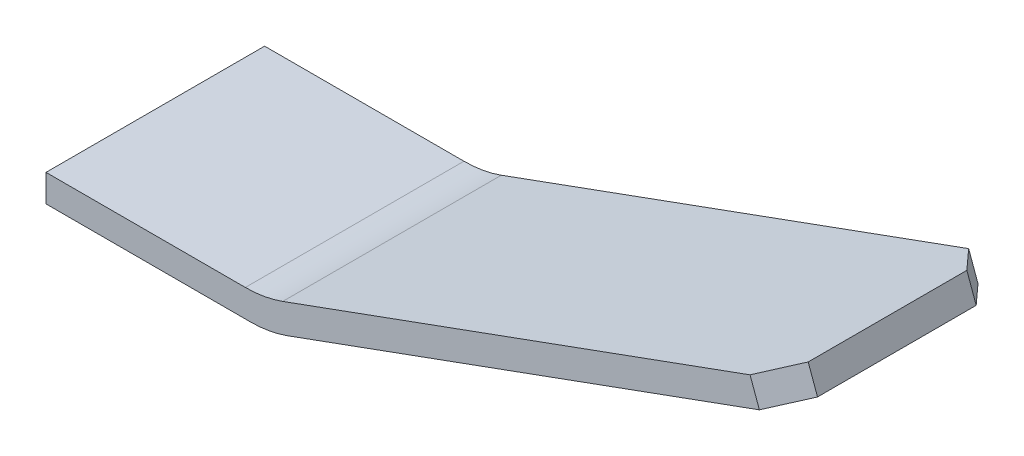
ISO-10303-21;
HEADER;
FILE_DESCRIPTION(('STEP AP214'),'2;1');
FILE_NAME('part.step','',(''),(''),'','','');
FILE_SCHEMA(('AUTOMOTIVE_DESIGN { 1 0 10303 214 1 1 1 1 }'));
ENDSEC;
DATA;
#1=APPLICATION_CONTEXT('core data for automotive mechanical design processes');
#2=APPLICATION_PROTOCOL_DEFINITION('international standard','automotive_design',2000,#1);
#3=PRODUCT_CONTEXT('',#1,'mechanical');
#4=PRODUCT('Part','Part','',(#3));
#5=PRODUCT_RELATED_PRODUCT_CATEGORY('part','',(#4));
#6=PRODUCT_DEFINITION_FORMATION('','',#4);
#7=PRODUCT_DEFINITION_CONTEXT('part definition',#1,'design');
#8=PRODUCT_DEFINITION('design','',#6,#7);
#9=PRODUCT_DEFINITION_SHAPE('','',#8);
#10=(LENGTH_UNIT() NAMED_UNIT(*) SI_UNIT(.MILLI.,.METRE.));
#11=(NAMED_UNIT(*) PLANE_ANGLE_UNIT() SI_UNIT($,.RADIAN.));
#12=(NAMED_UNIT(*) SI_UNIT($,.STERADIAN.) SOLID_ANGLE_UNIT());
#13=UNCERTAINTY_MEASURE_WITH_UNIT(LENGTH_MEASURE(1.E-05),#10,'distance_accuracy_value','');
#14=(GEOMETRIC_REPRESENTATION_CONTEXT(3) GLOBAL_UNCERTAINTY_ASSIGNED_CONTEXT((#13)) GLOBAL_UNIT_ASSIGNED_CONTEXT((#10,
#11,#12)) REPRESENTATION_CONTEXT('',''));
#15=CARTESIAN_POINT('',(0.,0.,0.));
#16=DIRECTION('',(0.,0.,1.));
#17=DIRECTION('',(1.,0.,0.));
#18=AXIS2_PLACEMENT_3D('',#15,#16,#17);
#19=CARTESIAN_POINT('',(25.9598381637494,0.,25.4));
#20=DIRECTION('',(0.,1.,0.));
#21=DIRECTION('',(-1.,0.,0.));
#22=AXIS2_PLACEMENT_3D('',#19,#20,#21);
#23=PLANE('',#22);
#24=DIRECTION('',(1.,0.,0.));
#25=VECTOR('',#24,1.);
#26=CARTESIAN_POINT('',(25.9598381637494,0.,0.));
#27=LINE('',#26,#25);
#28=CARTESIAN_POINT('',(0.,0.,0.));
#29=VERTEX_POINT('',#28);
#30=CARTESIAN_POINT('',(23.7204855087519,0.,0.));
#31=VERTEX_POINT('',#30);
#32=EDGE_CURVE('E171',#29,#31,#27,.T.);
#33=ORIENTED_EDGE('',*,*,#32,.T.);
#34=DIRECTION('',(0.,0.,-1.));
#35=VECTOR('',#34,1.);
#36=CARTESIAN_POINT('',(23.7204855087519,0.,25.4));
#37=LINE('',#36,#35);
#38=CARTESIAN_POINT('',(23.7204855087519,0.,25.4));
#39=VERTEX_POINT('',#38);
#40=EDGE_CURVE('E147',#31,#39,#37,.F.);
#41=ORIENTED_EDGE('',*,*,#40,.T.);
#42=DIRECTION('',(1.,0.,0.));
#43=VECTOR('',#42,1.);
#44=CARTESIAN_POINT('',(25.9598381637494,0.,25.4));
#45=LINE('',#44,#43);
#46=CARTESIAN_POINT('',(0.,0.,25.4));
#47=VERTEX_POINT('',#46);
#48=EDGE_CURVE('E175',#47,#39,#45,.T.);
#49=ORIENTED_EDGE('',*,*,#48,.F.);
#50=DIRECTION('',(0.,0.,-1.));
#51=VECTOR('',#50,1.);
#52=CARTESIAN_POINT('',(0.,0.,25.4));
#53=LINE('',#52,#51);
#54=EDGE_CURVE('E134',#47,#29,#53,.T.);
#55=ORIENTED_EDGE('',*,*,#54,.T.);
#56=EDGE_LOOP('',(#33,#41,#49,#55));
#57=FACE_BOUND('',#56,.T.);
#58=ADVANCED_FACE('F33',(#57),#23,.F.);
#59=CARTESIAN_POINT('',(86.1563953749641,21.9097550301848,25.4));
#60=DIRECTION('',(-0.34202014332567,0.939692620785908,0.));
#61=DIRECTION('',(-0.939692620785908,-0.34202014332567,0.));
#62=AXIS2_PLACEMENT_3D('',#59,#60,#61);
#63=PLANE('',#62);
#64=DIRECTION('',(0.,0.,-1.));
#65=VECTOR('',#64,1.);
#66=CARTESIAN_POINT('',(86.1563953749641,21.9097550301848,25.4));
#67=LINE('',#66,#65);
#68=CARTESIAN_POINT('',(86.1563953749641,21.9097550301848,21.9178849362202));
#69=VERTEX_POINT('',#68);
#70=CARTESIAN_POINT('',(86.1563953749641,21.9097550301848,3.48211506377976));
#71=VERTEX_POINT('',#70);
#72=EDGE_CURVE('E128',#69,#71,#67,.T.);
#73=ORIENTED_EDGE('',*,*,#72,.F.);
#74=DIRECTION('',(-0.664463024388674,-0.241844762647976,0.707106781186548));
#75=VECTOR('',#74,1.);
#76=CARTESIAN_POINT('',(84.5203364598835,21.3142782835896,23.6589424681101));
#77=LINE('',#76,#75);
#78=CARTESIAN_POINT('',(82.8842775448028,20.7188015369944,25.4));
#79=VERTEX_POINT('',#78);
#80=EDGE_CURVE('E111',#69,#79,#77,.T.);
#81=ORIENTED_EDGE('',*,*,#80,.T.);
#82=DIRECTION('',(0.939692620785908,0.34202014332567,0.));
#83=VECTOR('',#82,1.);
#84=CARTESIAN_POINT('',(86.1563953749641,21.9097550301848,25.4));
#85=LINE('',#84,#83);
#86=CARTESIAN_POINT('',(28.0641413289879,0.765903716018968,25.4));
#87=VERTEX_POINT('',#86);
#88=EDGE_CURVE('E196',#87,#79,#85,.T.);
#89=ORIENTED_EDGE('',*,*,#88,.F.);
#90=DIRECTION('',(0.,0.,-1.));
#91=VECTOR('',#90,1.);
#92=CARTESIAN_POINT('',(28.0641413289879,0.765903716018968,25.4));
#93=LINE('',#92,#91);
#94=CARTESIAN_POINT('',(28.0641413289879,0.765903716018968,0.));
#95=VERTEX_POINT('',#94);
#96=EDGE_CURVE('E142',#87,#95,#93,.T.);
#97=ORIENTED_EDGE('',*,*,#96,.T.);
#98=DIRECTION('',(0.939692620785908,0.34202014332567,0.));
#99=VECTOR('',#98,1.);
#100=CARTESIAN_POINT('',(86.1563953749641,21.9097550301848,0.));
#101=LINE('',#100,#99);
#102=CARTESIAN_POINT('',(82.8842775448028,20.7188015369944,0.));
#103=VERTEX_POINT('',#102);
#104=EDGE_CURVE('E167',#95,#103,#101,.T.);
#105=ORIENTED_EDGE('',*,*,#104,.T.);
#106=DIRECTION('',(0.664463024388674,0.241844762647976,0.707106781186548));
#107=VECTOR('',#106,1.);
#108=CARTESIAN_POINT('',(96.4544327438645,25.6579341038256,14.4410575318899));
#109=LINE('',#108,#107);
#110=EDGE_CURVE('E55',#103,#71,#109,.T.);
#111=ORIENTED_EDGE('',*,*,#110,.T.);
#112=EDGE_LOOP('',(#73,#81,#89,#97,#105,#111));
#113=FACE_BOUND('',#112,.T.);
#114=ADVANCED_FACE('F214',(#113),#63,.F.);
#115=CARTESIAN_POINT('',(85.0704814199051,24.8932791011801,25.4));
#116=DIRECTION('',(-0.939692620785908,-0.342020143325669,0.));
#117=DIRECTION('',(0.342020143325669,-0.939692620785908,0.));
#118=AXIS2_PLACEMENT_3D('',#115,#116,#117);
#119=PLANE('',#118);
#120=DIRECTION('',(0.,0.,-1.));
#121=VECTOR('',#120,1.);
#122=CARTESIAN_POINT('',(85.0704814199051,24.8932791011801,25.4));
#123=LINE('',#122,#121);
#124=CARTESIAN_POINT('',(85.0704814199051,24.8932791011801,21.9178849362202));
#125=VERTEX_POINT('',#124);
#126=CARTESIAN_POINT('',(85.0704814199051,24.8932791011801,3.48211506377976));
#127=VERTEX_POINT('',#126);
#128=EDGE_CURVE('E120',#125,#127,#123,.T.);
#129=ORIENTED_EDGE('',*,*,#128,.F.);
#130=DIRECTION('',(-0.34202014332567,0.939692620785908,0.));
#131=VECTOR('',#130,1.);
#132=CARTESIAN_POINT('',(93.1980549072992,2.56295446960685,21.9178849362202));
#133=LINE('',#132,#131);
#134=EDGE_CURVE('E108',#69,#125,#133,.T.);
#135=ORIENTED_EDGE('',*,*,#134,.F.);
#136=ORIENTED_EDGE('',*,*,#72,.T.);
#137=DIRECTION('',(-0.34202014332567,0.939692620785908,0.));
#138=VECTOR('',#137,1.);
#139=CARTESIAN_POINT('',(93.1980549072992,2.56295446960685,3.48211506377976));
#140=LINE('',#139,#138);
#141=EDGE_CURVE('E127',#71,#127,#140,.T.);
#142=ORIENTED_EDGE('',*,*,#141,.T.);
#143=EDGE_LOOP('',(#129,#135,#136,#142));
#144=FACE_BOUND('',#143,.T.);
#145=ADVANCED_FACE('F126',(#144),#119,.F.);
#146=CARTESIAN_POINT('',(25.4,3.175,25.4));
#147=DIRECTION('',(0.34202014332567,-0.939692620785908,0.));
#148=DIRECTION('',(0.939692620785908,0.34202014332567,0.));
#149=AXIS2_PLACEMENT_3D('',#146,#147,#148);
#150=PLANE('',#149);
#151=DIRECTION('',(-0.939692620785908,-0.34202014332567,0.));
#152=VECTOR('',#151,1.);
#153=CARTESIAN_POINT('',(25.4,3.175,25.4));
#154=LINE('',#153,#152);
#155=CARTESIAN_POINT('',(81.7983635897438,23.7023256079896,25.4));
#156=VERTEX_POINT('',#155);
#157=CARTESIAN_POINT('',(27.5043031652385,3.94090371601897,25.4));
#158=VERTEX_POINT('',#157);
#159=EDGE_CURVE('E123',#156,#158,#154,.T.);
#160=ORIENTED_EDGE('',*,*,#159,.F.);
#161=DIRECTION('',(-0.664463024388674,-0.241844762647976,0.707106781186548));
#162=VECTOR('',#161,1.);
#163=CARTESIAN_POINT('',(53.8086831998588,13.514915079447,55.1859957296206));
#164=LINE('',#163,#162);
#165=EDGE_CURVE('E48',#125,#156,#164,.T.);
#166=ORIENTED_EDGE('',*,*,#165,.F.);
#167=ORIENTED_EDGE('',*,*,#128,.T.);
#168=DIRECTION('',(0.664463024388674,0.241844762647976,0.707106781186548));
#169=VECTOR('',#168,1.);
#170=CARTESIAN_POINT('',(41.8745869158778,9.17125925921098,-42.4859957296206));
#171=LINE('',#170,#169);
#172=CARTESIAN_POINT('',(81.7983635897438,23.7023256079896,0.));
#173=VERTEX_POINT('',#172);
#174=EDGE_CURVE('E156',#173,#127,#171,.T.);
#175=ORIENTED_EDGE('',*,*,#174,.F.);
#176=DIRECTION('',(-0.939692620785908,-0.34202014332567,0.));
#177=VECTOR('',#176,1.);
#178=CARTESIAN_POINT('',(25.4,3.175,0.));
#179=LINE('',#178,#177);
#180=CARTESIAN_POINT('',(27.5043031652385,3.94090371601897,0.));
#181=VERTEX_POINT('',#180);
#182=EDGE_CURVE('E161',#173,#181,#179,.T.);
#183=ORIENTED_EDGE('',*,*,#182,.T.);
#184=DIRECTION('',(0.,0.,-1.));
#185=VECTOR('',#184,1.);
#186=CARTESIAN_POINT('',(27.5043031652385,3.94090371601897,25.4));
#187=LINE('',#186,#185);
#188=EDGE_CURVE('E140',#181,#158,#187,.F.);
#189=ORIENTED_EDGE('',*,*,#188,.T.);
#190=EDGE_LOOP('',(#160,#166,#167,#175,#183,#189));
#191=FACE_BOUND('',#190,.T.);
#192=ADVANCED_FACE('F118',(#191),#150,.F.);
#193=CARTESIAN_POINT('',(0.,3.175,25.4));
#194=DIRECTION('',(0.,-1.,0.));
#195=DIRECTION('',(0.,0.,-1.));
#196=AXIS2_PLACEMENT_3D('',#193,#194,#195);
#197=PLANE('',#196);
#198=DIRECTION('',(-1.,0.,0.));
#199=VECTOR('',#198,1.);
#200=CARTESIAN_POINT('',(0.,3.175,25.4));
#201=LINE('',#200,#199);
#202=CARTESIAN_POINT('',(23.1606473450025,3.175,25.4));
#203=VERTEX_POINT('',#202);
#204=CARTESIAN_POINT('',(0.,3.175,25.4));
#205=VERTEX_POINT('',#204);
#206=EDGE_CURVE('E183',#203,#205,#201,.T.);
#207=ORIENTED_EDGE('',*,*,#206,.F.);
#208=DIRECTION('',(0.,0.,-1.));
#209=VECTOR('',#208,1.);
#210=CARTESIAN_POINT('',(23.1606473450025,3.175,0.));
#211=LINE('',#210,#209);
#212=CARTESIAN_POINT('',(23.1606473450025,3.175,0.));
#213=VERTEX_POINT('',#212);
#214=EDGE_CURVE('E131',#203,#213,#211,.T.);
#215=ORIENTED_EDGE('',*,*,#214,.T.);
#216=DIRECTION('',(-1.,0.,0.));
#217=VECTOR('',#216,1.);
#218=CARTESIAN_POINT('',(0.,3.175,0.));
#219=LINE('',#218,#217);
#220=CARTESIAN_POINT('',(0.,3.175,0.));
#221=VERTEX_POINT('',#220);
#222=EDGE_CURVE('E166',#213,#221,#219,.T.);
#223=ORIENTED_EDGE('',*,*,#222,.T.);
#224=DIRECTION('',(0.,0.,-1.));
#225=VECTOR('',#224,1.);
#226=CARTESIAN_POINT('',(0.,3.175,25.4));
#227=LINE('',#226,#225);
#228=EDGE_CURVE('E129',#205,#221,#227,.T.);
#229=ORIENTED_EDGE('',*,*,#228,.F.);
#230=EDGE_LOOP('',(#207,#215,#223,#229));
#231=FACE_BOUND('',#230,.T.);
#232=ADVANCED_FACE('F205',(#231),#197,.F.);
#233=CARTESIAN_POINT('',(0.,0.,25.4));
#234=DIRECTION('',(1.,0.,0.));
#235=DIRECTION('',(0.,0.,-1.));
#236=AXIS2_PLACEMENT_3D('',#233,#234,#235);
#237=PLANE('',#236);
#238=DIRECTION('',(0.,-1.,0.));
#239=VECTOR('',#238,1.);
#240=CARTESIAN_POINT('',(0.,0.,0.));
#241=LINE('',#240,#239);
#242=EDGE_CURVE('E169',#221,#29,#241,.T.);
#243=ORIENTED_EDGE('',*,*,#242,.T.);
#244=ORIENTED_EDGE('',*,*,#54,.F.);
#245=DIRECTION('',(0.,-1.,0.));
#246=VECTOR('',#245,1.);
#247=CARTESIAN_POINT('',(0.,0.,25.4));
#248=LINE('',#247,#246);
#249=EDGE_CURVE('E177',#205,#47,#248,.T.);
#250=ORIENTED_EDGE('',*,*,#249,.F.);
#251=ORIENTED_EDGE('',*,*,#228,.T.);
#252=EDGE_LOOP('',(#243,#244,#250,#251));
#253=FACE_BOUND('',#252,.T.);
#254=ADVANCED_FACE('F209',(#253),#237,.F.);
#255=CARTESIAN_POINT('',(0.,0.,25.4));
#256=DIRECTION('',(0.,0.,-1.));
#257=DIRECTION('',(-1.,0.,0.));
#258=AXIS2_PLACEMENT_3D('',#255,#256,#257);
#259=PLANE('',#258);
#260=ORIENTED_EDGE('',*,*,#88,.T.);
#261=DIRECTION('',(-0.34202014332567,0.939692620785908,0.));
#262=VECTOR('',#261,1.);
#263=CARTESIAN_POINT('',(79.8475533477322,29.0621326975573,25.4));
#264=LINE('',#263,#262);
#265=EDGE_CURVE('E11',#79,#156,#264,.T.);
#266=ORIENTED_EDGE('',*,*,#265,.T.);
#267=ORIENTED_EDGE('',*,*,#159,.T.);
#268=CARTESIAN_POINT('',(23.1606473450025,15.875,25.4));
#269=DIRECTION('',(0.,0.,-1.));
#270=DIRECTION('',(-1.,0.,0.));
#271=AXIS2_PLACEMENT_3D('',#268,#269,#270);
#272=CIRCLE('',#271,12.7);
#273=EDGE_CURVE('E154',#158,#203,#272,.T.);
#274=ORIENTED_EDGE('',*,*,#273,.T.);
#275=ORIENTED_EDGE('',*,*,#206,.T.);
#276=ORIENTED_EDGE('',*,*,#249,.T.);
#277=ORIENTED_EDGE('',*,*,#48,.T.);
#278=CARTESIAN_POINT('',(23.7204855087519,12.7,25.4));
#279=DIRECTION('',(0.,0.,-1.));
#280=DIRECTION('',(-1.,0.,0.));
#281=AXIS2_PLACEMENT_3D('',#278,#279,#280);
#282=CIRCLE('',#281,12.7);
#283=EDGE_CURVE('E149',#39,#87,#282,.F.);
#284=ORIENTED_EDGE('',*,*,#283,.T.);
#285=EDGE_LOOP('',(#260,#266,#267,#274,#275,#276,#277,#284));
#286=FACE_BOUND('',#285,.T.);
#287=ADVANCED_FACE('F198',(#286),#259,.F.);
#288=CARTESIAN_POINT('',(0.,0.,0.));
#289=DIRECTION('',(0.,0.,-1.));
#290=DIRECTION('',(-1.,0.,0.));
#291=AXIS2_PLACEMENT_3D('',#288,#289,#290);
#292=PLANE('',#291);
#293=DIRECTION('',(-0.34202014332567,0.939692620785908,0.));
#294=VECTOR('',#293,1.);
#295=CARTESIAN_POINT('',(79.8475533477322,29.0621326975573,0.));
#296=LINE('',#295,#294);
#297=EDGE_CURVE('E41',#103,#173,#296,.T.);
#298=ORIENTED_EDGE('',*,*,#297,.F.);
#299=ORIENTED_EDGE('',*,*,#104,.F.);
#300=CARTESIAN_POINT('',(23.7204855087519,12.7,0.));
#301=DIRECTION('',(0.,0.,-1.));
#302=DIRECTION('',(-1.,0.,0.));
#303=AXIS2_PLACEMENT_3D('',#300,#301,#302);
#304=CIRCLE('',#303,12.7);
#305=EDGE_CURVE('E145',#95,#31,#304,.T.);
#306=ORIENTED_EDGE('',*,*,#305,.T.);
#307=ORIENTED_EDGE('',*,*,#32,.F.);
#308=ORIENTED_EDGE('',*,*,#242,.F.);
#309=ORIENTED_EDGE('',*,*,#222,.F.);
#310=CARTESIAN_POINT('',(23.1606473450025,15.875,0.));
#311=DIRECTION('',(0.,0.,-1.));
#312=DIRECTION('',(-1.,0.,0.));
#313=AXIS2_PLACEMENT_3D('',#310,#311,#312);
#314=CIRCLE('',#313,12.7);
#315=EDGE_CURVE('E151',#213,#181,#314,.F.);
#316=ORIENTED_EDGE('',*,*,#315,.T.);
#317=ORIENTED_EDGE('',*,*,#182,.F.);
#318=EDGE_LOOP('',(#298,#299,#306,#307,#308,#309,#316,#317));
#319=FACE_BOUND('',#318,.T.);
#320=ADVANCED_FACE('F163',(#319),#292,.T.);
#321=CARTESIAN_POINT('',(23.1606473450025,15.875,25.4));
#322=DIRECTION('',(0.,0.,1.));
#323=DIRECTION('',(1.,0.,0.));
#324=AXIS2_PLACEMENT_3D('',#321,#322,#323);
#325=CYLINDRICAL_SURFACE('',#324,12.7);
#326=ORIENTED_EDGE('',*,*,#273,.F.);
#327=ORIENTED_EDGE('',*,*,#188,.F.);
#328=ORIENTED_EDGE('',*,*,#315,.F.);
#329=ORIENTED_EDGE('',*,*,#214,.F.);
#330=EDGE_LOOP('',(#326,#327,#328,#329));
#331=FACE_BOUND('',#330,.T.);
#332=ADVANCED_FACE('F203',(#331),#325,.F.);
#333=CARTESIAN_POINT('',(23.7204855087519,12.7,25.4));
#334=DIRECTION('',(0.,0.,-1.));
#335=DIRECTION('',(-1.,0.,0.));
#336=AXIS2_PLACEMENT_3D('',#333,#334,#335);
#337=CYLINDRICAL_SURFACE('',#336,12.7);
#338=ORIENTED_EDGE('',*,*,#283,.F.);
#339=ORIENTED_EDGE('',*,*,#40,.F.);
#340=ORIENTED_EDGE('',*,*,#305,.F.);
#341=ORIENTED_EDGE('',*,*,#96,.F.);
#342=EDGE_LOOP('',(#338,#339,#340,#341));
#343=FACE_BOUND('',#342,.T.);
#344=ADVANCED_FACE('F35',(#343),#337,.T.);
#345=CARTESIAN_POINT('',(50.0021604032719,-13.1590653723622,-42.4859957296206));
#346=DIRECTION('',(-0.664463024388675,-0.241844762647976,0.707106781186547));
#347=DIRECTION('',(0.728739444818683,0.,0.684791078771736));
#348=AXIS2_PLACEMENT_3D('',#345,#346,#347);
#349=PLANE('',#348);
#350=ORIENTED_EDGE('',*,*,#297,.T.);
#351=ORIENTED_EDGE('',*,*,#174,.T.);
#352=ORIENTED_EDGE('',*,*,#141,.F.);
#353=ORIENTED_EDGE('',*,*,#110,.F.);
#354=EDGE_LOOP('',(#350,#351,#352,#353));
#355=FACE_BOUND('',#354,.T.);
#356=ADVANCED_FACE('F155',(#355),#349,.F.);
#357=CARTESIAN_POINT('',(61.9362566872529,-8.81540955212622,55.1859957296206));
#358=DIRECTION('',(-0.664463024388675,-0.241844762647976,-0.707106781186547));
#359=DIRECTION('',(-0.728739444818683,0.,0.684791078771736));
#360=AXIS2_PLACEMENT_3D('',#357,#358,#359);
#361=PLANE('',#360);
#362=ORIENTED_EDGE('',*,*,#134,.T.);
#363=ORIENTED_EDGE('',*,*,#165,.T.);
#364=ORIENTED_EDGE('',*,*,#265,.F.);
#365=ORIENTED_EDGE('',*,*,#80,.F.);
#366=EDGE_LOOP('',(#362,#363,#364,#365));
#367=FACE_BOUND('',#366,.T.);
#368=ADVANCED_FACE('F109',(#367),#361,.F.);
#369=CLOSED_SHELL('',(#58,#114,#145,#192,#232,#254,#287,#320,#332,#344,#356,#368));
#370=MANIFOLD_SOLID_BREP('B2',#369);
#371=ADVANCED_BREP_SHAPE_REPRESENTATION('',(#18,#370),#14);
#372=SHAPE_DEFINITION_REPRESENTATION(#9,#371);
ENDSEC;
END-ISO-10303-21;
